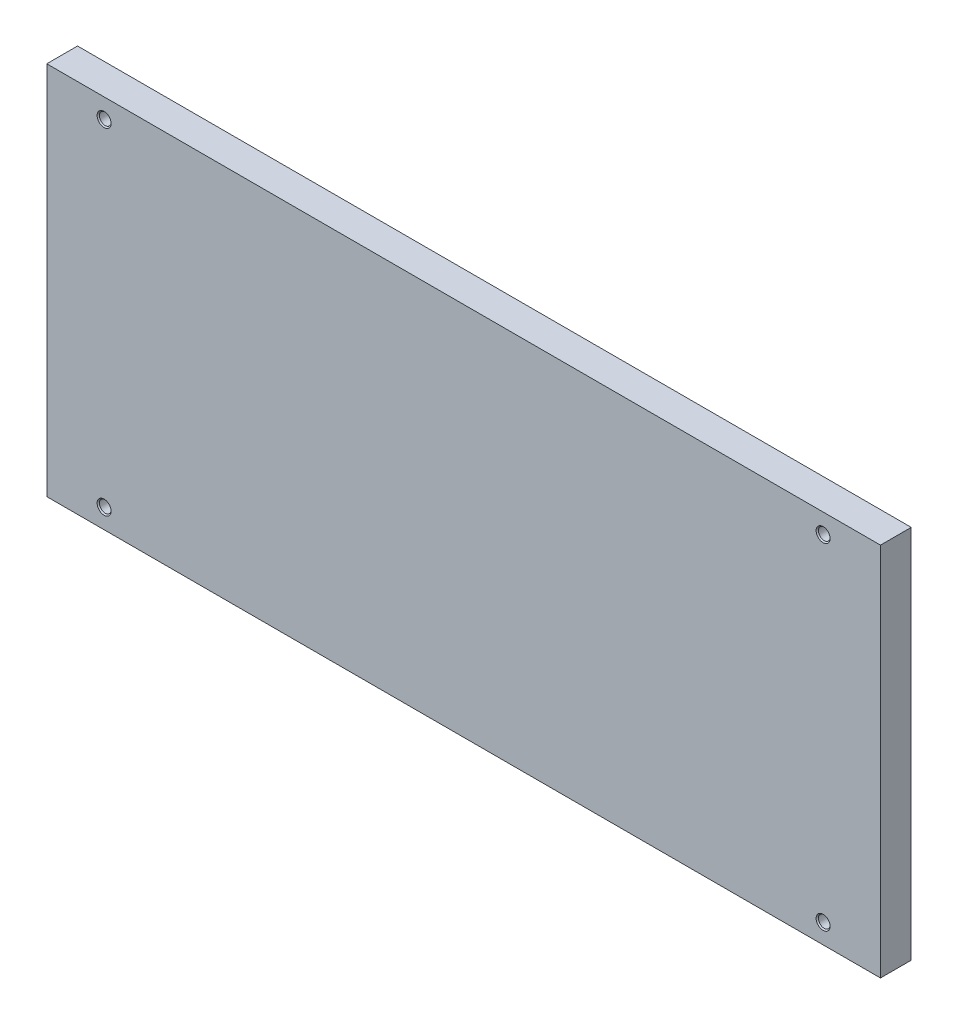
ISO-10303-21;
HEADER;
FILE_DESCRIPTION(('STEP AP214'),'2;1');
FILE_NAME('part.step','',(''),(''),'','','');
FILE_SCHEMA(('AUTOMOTIVE_DESIGN { 1 0 10303 214 1 1 1 1 }'));
ENDSEC;
DATA;
#1=APPLICATION_CONTEXT('core data for automotive mechanical design processes');
#2=APPLICATION_PROTOCOL_DEFINITION('international standard','automotive_design',2000,#1);
#3=PRODUCT_CONTEXT('',#1,'mechanical');
#4=PRODUCT('Part','Part','',(#3));
#5=PRODUCT_RELATED_PRODUCT_CATEGORY('part','',(#4));
#6=PRODUCT_DEFINITION_FORMATION('','',#4);
#7=PRODUCT_DEFINITION_CONTEXT('part definition',#1,'design');
#8=PRODUCT_DEFINITION('design','',#6,#7);
#9=PRODUCT_DEFINITION_SHAPE('','',#8);
#10=(LENGTH_UNIT() NAMED_UNIT(*) SI_UNIT(.MILLI.,.METRE.));
#11=(NAMED_UNIT(*) PLANE_ANGLE_UNIT() SI_UNIT($,.RADIAN.));
#12=(NAMED_UNIT(*) SI_UNIT($,.STERADIAN.) SOLID_ANGLE_UNIT());
#13=UNCERTAINTY_MEASURE_WITH_UNIT(LENGTH_MEASURE(1.E-05),#10,'distance_accuracy_value','');
#14=(GEOMETRIC_REPRESENTATION_CONTEXT(3) GLOBAL_UNCERTAINTY_ASSIGNED_CONTEXT((#13)) GLOBAL_UNIT_ASSIGNED_CONTEXT((#10,
#11,#12)) REPRESENTATION_CONTEXT('',''));
#15=CARTESIAN_POINT('',(0.,0.,0.));
#16=DIRECTION('',(0.,0.,1.));
#17=DIRECTION('',(1.,0.,0.));
#18=AXIS2_PLACEMENT_3D('',#15,#16,#17);
#19=CARTESIAN_POINT('',(0.,0.,22.));
#20=DIRECTION('',(0.,0.,1.));
#21=DIRECTION('',(1.,0.,0.));
#22=AXIS2_PLACEMENT_3D('',#19,#20,#21);
#23=PLANE('',#22);
#24=CARTESIAN_POINT('',(257.,120.,22.));
#25=DIRECTION('',(0.,0.,1.));
#26=DIRECTION('',(1.,0.,0.));
#27=AXIS2_PLACEMENT_3D('',#24,#25,#26);
#28=CIRCLE('',#27,5.);
#29=CARTESIAN_POINT('',(262.,120.,22.));
#30=VERTEX_POINT('',#29);
#31=EDGE_CURVE('E139',#30,#30,#28,.T.);
#32=ORIENTED_EDGE('',*,*,#31,.F.);
#33=EDGE_LOOP('',(#32));
#34=FACE_BOUND('',#33,.T.);
#35=CARTESIAN_POINT('',(-257.,120.,22.));
#36=DIRECTION('',(0.,0.,1.));
#37=DIRECTION('',(1.,0.,0.));
#38=AXIS2_PLACEMENT_3D('',#35,#36,#37);
#39=CIRCLE('',#38,5.);
#40=CARTESIAN_POINT('',(-252.,120.,22.));
#41=VERTEX_POINT('',#40);
#42=EDGE_CURVE('E104',#41,#41,#39,.T.);
#43=ORIENTED_EDGE('',*,*,#42,.F.);
#44=EDGE_LOOP('',(#43));
#45=FACE_BOUND('',#44,.T.);
#46=DIRECTION('',(0.,-1.,0.));
#47=VECTOR('',#46,1.);
#48=CARTESIAN_POINT('',(-298.,134.,22.));
#49=LINE('',#48,#47);
#50=CARTESIAN_POINT('',(-298.,134.,22.));
#51=VERTEX_POINT('',#50);
#52=CARTESIAN_POINT('',(-298.,-134.,22.));
#53=VERTEX_POINT('',#52);
#54=EDGE_CURVE('E89',#51,#53,#49,.T.);
#55=ORIENTED_EDGE('',*,*,#54,.T.);
#56=DIRECTION('',(1.,0.,0.));
#57=VECTOR('',#56,1.);
#58=CARTESIAN_POINT('',(-298.,-134.,22.));
#59=LINE('',#58,#57);
#60=CARTESIAN_POINT('',(298.,-134.,22.));
#61=VERTEX_POINT('',#60);
#62=EDGE_CURVE('E84',#53,#61,#59,.T.);
#63=ORIENTED_EDGE('',*,*,#62,.T.);
#64=DIRECTION('',(0.,1.,0.));
#65=VECTOR('',#64,1.);
#66=CARTESIAN_POINT('',(298.,-134.,22.));
#67=LINE('',#66,#65);
#68=CARTESIAN_POINT('',(298.,134.,22.));
#69=VERTEX_POINT('',#68);
#70=EDGE_CURVE('E87',#61,#69,#67,.T.);
#71=ORIENTED_EDGE('',*,*,#70,.T.);
#72=DIRECTION('',(-1.,0.,0.));
#73=VECTOR('',#72,1.);
#74=CARTESIAN_POINT('',(298.,134.,22.));
#75=LINE('',#74,#73);
#76=EDGE_CURVE('E54',#69,#51,#75,.T.);
#77=ORIENTED_EDGE('',*,*,#76,.T.);
#78=EDGE_LOOP('',(#55,#63,#71,#77));
#79=FACE_BOUND('',#78,.T.);
#80=CARTESIAN_POINT('',(-257.,-120.,22.));
#81=DIRECTION('',(0.,0.,-1.));
#82=DIRECTION('',(-1.,0.,0.));
#83=AXIS2_PLACEMENT_3D('',#80,#81,#82);
#84=CIRCLE('',#83,5.);
#85=CARTESIAN_POINT('',(-262.,-120.,22.));
#86=VERTEX_POINT('',#85);
#87=EDGE_CURVE('E136',#86,#86,#84,.T.);
#88=ORIENTED_EDGE('',*,*,#87,.T.);
#89=EDGE_LOOP('',(#88));
#90=FACE_BOUND('',#89,.T.);
#91=CARTESIAN_POINT('',(257.,-120.,22.));
#92=DIRECTION('',(0.,0.,-1.));
#93=DIRECTION('',(-1.,0.,0.));
#94=AXIS2_PLACEMENT_3D('',#91,#92,#93);
#95=CIRCLE('',#94,5.);
#96=CARTESIAN_POINT('',(252.,-120.,22.));
#97=VERTEX_POINT('',#96);
#98=EDGE_CURVE('E160',#97,#97,#95,.T.);
#99=ORIENTED_EDGE('',*,*,#98,.T.);
#100=EDGE_LOOP('',(#99));
#101=FACE_BOUND('',#100,.T.);
#102=ADVANCED_FACE('F37',(#34,#45,#79,#90,#101),#23,.T.);
#103=CARTESIAN_POINT('',(0.,0.,0.));
#104=DIRECTION('',(0.,0.,1.));
#105=DIRECTION('',(1.,0.,0.));
#106=AXIS2_PLACEMENT_3D('',#103,#104,#105);
#107=PLANE('',#106);
#108=CARTESIAN_POINT('',(257.,120.,0.));
#109=DIRECTION('',(0.,0.,1.));
#110=DIRECTION('',(1.,0.,0.));
#111=AXIS2_PLACEMENT_3D('',#108,#109,#110);
#112=CIRCLE('',#111,5.);
#113=CARTESIAN_POINT('',(262.,120.,0.));
#114=VERTEX_POINT('',#113);
#115=EDGE_CURVE('E148',#114,#114,#112,.T.);
#116=ORIENTED_EDGE('',*,*,#115,.T.);
#117=EDGE_LOOP('',(#116));
#118=FACE_BOUND('',#117,.T.);
#119=CARTESIAN_POINT('',(-257.,120.,0.));
#120=DIRECTION('',(0.,0.,1.));
#121=DIRECTION('',(1.,0.,0.));
#122=AXIS2_PLACEMENT_3D('',#119,#120,#121);
#123=CIRCLE('',#122,5.);
#124=CARTESIAN_POINT('',(-252.,120.,0.));
#125=VERTEX_POINT('',#124);
#126=EDGE_CURVE('E124',#125,#125,#123,.T.);
#127=ORIENTED_EDGE('',*,*,#126,.T.);
#128=EDGE_LOOP('',(#127));
#129=FACE_BOUND('',#128,.T.);
#130=DIRECTION('',(0.,-1.,0.));
#131=VECTOR('',#130,1.);
#132=CARTESIAN_POINT('',(-298.,134.,0.));
#133=LINE('',#132,#131);
#134=CARTESIAN_POINT('',(-298.,134.,0.));
#135=VERTEX_POINT('',#134);
#136=CARTESIAN_POINT('',(-298.,-134.,0.));
#137=VERTEX_POINT('',#136);
#138=EDGE_CURVE('E101',#135,#137,#133,.T.);
#139=ORIENTED_EDGE('',*,*,#138,.F.);
#140=DIRECTION('',(-1.,0.,0.));
#141=VECTOR('',#140,1.);
#142=CARTESIAN_POINT('',(298.,134.,0.));
#143=LINE('',#142,#141);
#144=CARTESIAN_POINT('',(298.,134.,0.));
#145=VERTEX_POINT('',#144);
#146=EDGE_CURVE('E77',#145,#135,#143,.T.);
#147=ORIENTED_EDGE('',*,*,#146,.F.);
#148=DIRECTION('',(0.,1.,0.));
#149=VECTOR('',#148,1.);
#150=CARTESIAN_POINT('',(298.,-134.,0.));
#151=LINE('',#150,#149);
#152=CARTESIAN_POINT('',(298.,-134.,0.));
#153=VERTEX_POINT('',#152);
#154=EDGE_CURVE('E71',#153,#145,#151,.T.);
#155=ORIENTED_EDGE('',*,*,#154,.F.);
#156=DIRECTION('',(1.,0.,0.));
#157=VECTOR('',#156,1.);
#158=CARTESIAN_POINT('',(-298.,-134.,0.));
#159=LINE('',#158,#157);
#160=EDGE_CURVE('E93',#137,#153,#159,.T.);
#161=ORIENTED_EDGE('',*,*,#160,.F.);
#162=EDGE_LOOP('',(#139,#147,#155,#161));
#163=FACE_BOUND('',#162,.T.);
#164=CARTESIAN_POINT('',(-257.,-120.,0.));
#165=DIRECTION('',(0.,0.,-1.));
#166=DIRECTION('',(-1.,0.,0.));
#167=AXIS2_PLACEMENT_3D('',#164,#165,#166);
#168=CIRCLE('',#167,5.);
#169=CARTESIAN_POINT('',(-262.,-120.,0.));
#170=VERTEX_POINT('',#169);
#171=EDGE_CURVE('E127',#170,#170,#168,.T.);
#172=ORIENTED_EDGE('',*,*,#171,.F.);
#173=EDGE_LOOP('',(#172));
#174=FACE_BOUND('',#173,.T.);
#175=CARTESIAN_POINT('',(257.,-120.,0.));
#176=DIRECTION('',(0.,0.,-1.));
#177=DIRECTION('',(-1.,0.,0.));
#178=AXIS2_PLACEMENT_3D('',#175,#176,#177);
#179=CIRCLE('',#178,5.);
#180=CARTESIAN_POINT('',(252.,-120.,0.));
#181=VERTEX_POINT('',#180);
#182=EDGE_CURVE('E151',#181,#181,#179,.T.);
#183=ORIENTED_EDGE('',*,*,#182,.F.);
#184=EDGE_LOOP('',(#183));
#185=FACE_BOUND('',#184,.T.);
#186=ADVANCED_FACE('F112',(#118,#129,#163,#174,#185),#107,.F.);
#187=CARTESIAN_POINT('',(-298.,134.,22.));
#188=DIRECTION('',(1.,0.,0.));
#189=DIRECTION('',(0.,0.,-1.));
#190=AXIS2_PLACEMENT_3D('',#187,#188,#189);
#191=PLANE('',#190);
#192=ORIENTED_EDGE('',*,*,#138,.T.);
#193=DIRECTION('',(0.,0.,-1.));
#194=VECTOR('',#193,1.);
#195=CARTESIAN_POINT('',(-298.,-134.,22.));
#196=LINE('',#195,#194);
#197=EDGE_CURVE('E11',#53,#137,#196,.T.);
#198=ORIENTED_EDGE('',*,*,#197,.F.);
#199=ORIENTED_EDGE('',*,*,#54,.F.);
#200=DIRECTION('',(0.,0.,-1.));
#201=VECTOR('',#200,1.);
#202=CARTESIAN_POINT('',(-298.,134.,22.));
#203=LINE('',#202,#201);
#204=EDGE_CURVE('E97',#51,#135,#203,.T.);
#205=ORIENTED_EDGE('',*,*,#204,.T.);
#206=EDGE_LOOP('',(#192,#198,#199,#205));
#207=FACE_BOUND('',#206,.T.);
#208=ADVANCED_FACE('F39',(#207),#191,.F.);
#209=CARTESIAN_POINT('',(-298.,-134.,22.));
#210=DIRECTION('',(0.,1.,0.));
#211=DIRECTION('',(0.,0.,1.));
#212=AXIS2_PLACEMENT_3D('',#209,#210,#211);
#213=PLANE('',#212);
#214=ORIENTED_EDGE('',*,*,#160,.T.);
#215=DIRECTION('',(0.,0.,-1.));
#216=VECTOR('',#215,1.);
#217=CARTESIAN_POINT('',(298.,-134.,22.));
#218=LINE('',#217,#216);
#219=EDGE_CURVE('E46',#61,#153,#218,.T.);
#220=ORIENTED_EDGE('',*,*,#219,.F.);
#221=ORIENTED_EDGE('',*,*,#62,.F.);
#222=ORIENTED_EDGE('',*,*,#197,.T.);
#223=EDGE_LOOP('',(#214,#220,#221,#222));
#224=FACE_BOUND('',#223,.T.);
#225=ADVANCED_FACE('F92',(#224),#213,.F.);
#226=CARTESIAN_POINT('',(298.,-134.,22.));
#227=DIRECTION('',(-1.,0.,0.));
#228=DIRECTION('',(0.,0.,1.));
#229=AXIS2_PLACEMENT_3D('',#226,#227,#228);
#230=PLANE('',#229);
#231=ORIENTED_EDGE('',*,*,#154,.T.);
#232=DIRECTION('',(0.,0.,-1.));
#233=VECTOR('',#232,1.);
#234=CARTESIAN_POINT('',(298.,134.,22.));
#235=LINE('',#234,#233);
#236=EDGE_CURVE('E94',#69,#145,#235,.T.);
#237=ORIENTED_EDGE('',*,*,#236,.F.);
#238=ORIENTED_EDGE('',*,*,#70,.F.);
#239=ORIENTED_EDGE('',*,*,#219,.T.);
#240=EDGE_LOOP('',(#231,#237,#238,#239));
#241=FACE_BOUND('',#240,.T.);
#242=ADVANCED_FACE('F95',(#241),#230,.F.);
#243=CARTESIAN_POINT('',(298.,134.,22.));
#244=DIRECTION('',(0.,-1.,0.));
#245=DIRECTION('',(0.,0.,-1.));
#246=AXIS2_PLACEMENT_3D('',#243,#244,#245);
#247=PLANE('',#246);
#248=ORIENTED_EDGE('',*,*,#146,.T.);
#249=ORIENTED_EDGE('',*,*,#204,.F.);
#250=ORIENTED_EDGE('',*,*,#76,.F.);
#251=ORIENTED_EDGE('',*,*,#236,.T.);
#252=EDGE_LOOP('',(#248,#249,#250,#251));
#253=FACE_BOUND('',#252,.T.);
#254=ADVANCED_FACE('F109',(#253),#247,.F.);
#255=CARTESIAN_POINT('',(-257.,120.,21.188));
#256=DIRECTION('',(0.,0.,1.));
#257=DIRECTION('',(1.,0.,0.));
#258=AXIS2_PLACEMENT_3D('',#255,#256,#257);
#259=CONICAL_SURFACE('',#258,4.18800000000001,0.785398163397446);
#260=ORIENTED_EDGE('',*,*,#42,.T.);
#261=EDGE_LOOP('',(#260));
#262=FACE_BOUND('',#261,.T.);
#263=CARTESIAN_POINT('',(-257.,120.,21.188));
#264=DIRECTION('',(0.,0.,1.));
#265=DIRECTION('',(1.,0.,0.));
#266=AXIS2_PLACEMENT_3D('',#263,#264,#265);
#267=CIRCLE('',#266,4.18800000000001);
#268=CARTESIAN_POINT('',(-252.812,120.,21.188));
#269=VERTEX_POINT('',#268);
#270=EDGE_CURVE('E118',#269,#269,#267,.T.);
#271=ORIENTED_EDGE('',*,*,#270,.F.);
#272=EDGE_LOOP('',(#271));
#273=FACE_BOUND('',#272,.T.);
#274=ADVANCED_FACE('F187',(#262,#273),#259,.F.);
#275=CARTESIAN_POINT('',(-257.,120.,0.));
#276=DIRECTION('',(0.,0.,1.));
#277=DIRECTION('',(1.,0.,0.));
#278=AXIS2_PLACEMENT_3D('',#275,#276,#277);
#279=CYLINDRICAL_SURFACE('',#278,4.18800000000001);
#280=ORIENTED_EDGE('',*,*,#270,.T.);
#281=EDGE_LOOP('',(#280));
#282=FACE_BOUND('',#281,.T.);
#283=CARTESIAN_POINT('',(-257.,120.,0.811999999999998));
#284=DIRECTION('',(0.,0.,1.));
#285=DIRECTION('',(1.,0.,0.));
#286=AXIS2_PLACEMENT_3D('',#283,#284,#285);
#287=CIRCLE('',#286,4.18800000000001);
#288=CARTESIAN_POINT('',(-252.812,120.,0.811999999999998));
#289=VERTEX_POINT('',#288);
#290=EDGE_CURVE('E121',#289,#289,#287,.T.);
#291=ORIENTED_EDGE('',*,*,#290,.F.);
#292=EDGE_LOOP('',(#291));
#293=FACE_BOUND('',#292,.T.);
#294=ADVANCED_FACE('F305',(#282,#293),#279,.F.);
#295=CARTESIAN_POINT('',(-257.,120.,0.));
#296=DIRECTION('',(0.,0.,-1.));
#297=DIRECTION('',(-1.,0.,0.));
#298=AXIS2_PLACEMENT_3D('',#295,#296,#297);
#299=CONICAL_SURFACE('',#298,5.,0.785398163397446);
#300=ORIENTED_EDGE('',*,*,#290,.T.);
#301=EDGE_LOOP('',(#300));
#302=FACE_BOUND('',#301,.T.);
#303=ORIENTED_EDGE('',*,*,#126,.F.);
#304=EDGE_LOOP('',(#303));
#305=FACE_BOUND('',#304,.T.);
#306=ADVANCED_FACE('F295',(#302,#305),#299,.F.);
#307=CARTESIAN_POINT('',(-257.,-120.,0.811999999999997));
#308=DIRECTION('',(0.,0.,-1.));
#309=DIRECTION('',(-1.,0.,0.));
#310=AXIS2_PLACEMENT_3D('',#307,#308,#309);
#311=CONICAL_SURFACE('',#310,4.18800000000001,0.785398163397446);
#312=ORIENTED_EDGE('',*,*,#171,.T.);
#313=EDGE_LOOP('',(#312));
#314=FACE_BOUND('',#313,.T.);
#315=CARTESIAN_POINT('',(-257.,-120.,0.811999999999997));
#316=DIRECTION('',(0.,0.,-1.));
#317=DIRECTION('',(-1.,0.,0.));
#318=AXIS2_PLACEMENT_3D('',#315,#316,#317);
#319=CIRCLE('',#318,4.18800000000001);
#320=CARTESIAN_POINT('',(-261.188,-120.,0.811999999999997));
#321=VERTEX_POINT('',#320);
#322=EDGE_CURVE('E130',#321,#321,#319,.T.);
#323=ORIENTED_EDGE('',*,*,#322,.F.);
#324=EDGE_LOOP('',(#323));
#325=FACE_BOUND('',#324,.T.);
#326=ADVANCED_FACE('F285',(#314,#325),#311,.F.);
#327=CARTESIAN_POINT('',(-257.,-120.,22.));
#328=DIRECTION('',(0.,0.,-1.));
#329=DIRECTION('',(-1.,0.,0.));
#330=AXIS2_PLACEMENT_3D('',#327,#328,#329);
#331=CYLINDRICAL_SURFACE('',#330,4.18800000000001);
#332=ORIENTED_EDGE('',*,*,#322,.T.);
#333=EDGE_LOOP('',(#332));
#334=FACE_BOUND('',#333,.T.);
#335=CARTESIAN_POINT('',(-257.,-120.,21.188));
#336=DIRECTION('',(0.,0.,-1.));
#337=DIRECTION('',(-1.,0.,0.));
#338=AXIS2_PLACEMENT_3D('',#335,#336,#337);
#339=CIRCLE('',#338,4.18800000000001);
#340=CARTESIAN_POINT('',(-261.188,-120.,21.188));
#341=VERTEX_POINT('',#340);
#342=EDGE_CURVE('E133',#341,#341,#339,.T.);
#343=ORIENTED_EDGE('',*,*,#342,.F.);
#344=EDGE_LOOP('',(#343));
#345=FACE_BOUND('',#344,.T.);
#346=ADVANCED_FACE('F275',(#334,#345),#331,.F.);
#347=CARTESIAN_POINT('',(-257.,-120.,22.));
#348=DIRECTION('',(0.,0.,1.));
#349=DIRECTION('',(1.,0.,0.));
#350=AXIS2_PLACEMENT_3D('',#347,#348,#349);
#351=CONICAL_SURFACE('',#350,5.,0.785398163397442);
#352=ORIENTED_EDGE('',*,*,#342,.T.);
#353=EDGE_LOOP('',(#352));
#354=FACE_BOUND('',#353,.T.);
#355=ORIENTED_EDGE('',*,*,#87,.F.);
#356=EDGE_LOOP('',(#355));
#357=FACE_BOUND('',#356,.T.);
#358=ADVANCED_FACE('F265',(#354,#357),#351,.F.);
#359=CARTESIAN_POINT('',(257.,120.,21.188));
#360=DIRECTION('',(0.,0.,1.));
#361=DIRECTION('',(1.,0.,0.));
#362=AXIS2_PLACEMENT_3D('',#359,#360,#361);
#363=CONICAL_SURFACE('',#362,4.18800000000001,0.785398163397446);
#364=ORIENTED_EDGE('',*,*,#31,.T.);
#365=EDGE_LOOP('',(#364));
#366=FACE_BOUND('',#365,.T.);
#367=CARTESIAN_POINT('',(257.,120.,21.188));
#368=DIRECTION('',(0.,0.,1.));
#369=DIRECTION('',(1.,0.,0.));
#370=AXIS2_PLACEMENT_3D('',#367,#368,#369);
#371=CIRCLE('',#370,4.18800000000001);
#372=CARTESIAN_POINT('',(261.188,120.,21.188));
#373=VERTEX_POINT('',#372);
#374=EDGE_CURVE('E142',#373,#373,#371,.T.);
#375=ORIENTED_EDGE('',*,*,#374,.F.);
#376=EDGE_LOOP('',(#375));
#377=FACE_BOUND('',#376,.T.);
#378=ADVANCED_FACE('F256',(#366,#377),#363,.F.);
#379=CARTESIAN_POINT('',(257.,120.,0.));
#380=DIRECTION('',(0.,0.,1.));
#381=DIRECTION('',(1.,0.,0.));
#382=AXIS2_PLACEMENT_3D('',#379,#380,#381);
#383=CYLINDRICAL_SURFACE('',#382,4.18800000000001);
#384=ORIENTED_EDGE('',*,*,#374,.T.);
#385=EDGE_LOOP('',(#384));
#386=FACE_BOUND('',#385,.T.);
#387=CARTESIAN_POINT('',(257.,120.,0.811999999999998));
#388=DIRECTION('',(0.,0.,1.));
#389=DIRECTION('',(1.,0.,0.));
#390=AXIS2_PLACEMENT_3D('',#387,#388,#389);
#391=CIRCLE('',#390,4.18800000000001);
#392=CARTESIAN_POINT('',(261.188,120.,0.811999999999998));
#393=VERTEX_POINT('',#392);
#394=EDGE_CURVE('E145',#393,#393,#391,.T.);
#395=ORIENTED_EDGE('',*,*,#394,.F.);
#396=EDGE_LOOP('',(#395));
#397=FACE_BOUND('',#396,.T.);
#398=ADVANCED_FACE('F246',(#386,#397),#383,.F.);
#399=CARTESIAN_POINT('',(257.,120.,0.));
#400=DIRECTION('',(0.,0.,-1.));
#401=DIRECTION('',(-1.,0.,0.));
#402=AXIS2_PLACEMENT_3D('',#399,#400,#401);
#403=CONICAL_SURFACE('',#402,5.,0.785398163397446);
#404=ORIENTED_EDGE('',*,*,#394,.T.);
#405=EDGE_LOOP('',(#404));
#406=FACE_BOUND('',#405,.T.);
#407=ORIENTED_EDGE('',*,*,#115,.F.);
#408=EDGE_LOOP('',(#407));
#409=FACE_BOUND('',#408,.T.);
#410=ADVANCED_FACE('F229',(#406,#409),#403,.F.);
#411=CARTESIAN_POINT('',(257.,-120.,0.811999999999997));
#412=DIRECTION('',(0.,0.,-1.));
#413=DIRECTION('',(-1.,0.,0.));
#414=AXIS2_PLACEMENT_3D('',#411,#412,#413);
#415=CONICAL_SURFACE('',#414,4.18800000000001,0.785398163397446);
#416=ORIENTED_EDGE('',*,*,#182,.T.);
#417=EDGE_LOOP('',(#416));
#418=FACE_BOUND('',#417,.T.);
#419=CARTESIAN_POINT('',(257.,-120.,0.811999999999997));
#420=DIRECTION('',(0.,0.,-1.));
#421=DIRECTION('',(-1.,0.,0.));
#422=AXIS2_PLACEMENT_3D('',#419,#420,#421);
#423=CIRCLE('',#422,4.18800000000001);
#424=CARTESIAN_POINT('',(252.812,-120.,0.811999999999997));
#425=VERTEX_POINT('',#424);
#426=EDGE_CURVE('E154',#425,#425,#423,.T.);
#427=ORIENTED_EDGE('',*,*,#426,.F.);
#428=EDGE_LOOP('',(#427));
#429=FACE_BOUND('',#428,.T.);
#430=ADVANCED_FACE('F173',(#418,#429),#415,.F.);
#431=CARTESIAN_POINT('',(257.,-120.,22.));
#432=DIRECTION('',(0.,0.,-1.));
#433=DIRECTION('',(-1.,0.,0.));
#434=AXIS2_PLACEMENT_3D('',#431,#432,#433);
#435=CYLINDRICAL_SURFACE('',#434,4.18800000000001);
#436=ORIENTED_EDGE('',*,*,#426,.T.);
#437=EDGE_LOOP('',(#436));
#438=FACE_BOUND('',#437,.T.);
#439=CARTESIAN_POINT('',(257.,-120.,21.188));
#440=DIRECTION('',(0.,0.,-1.));
#441=DIRECTION('',(-1.,0.,0.));
#442=AXIS2_PLACEMENT_3D('',#439,#440,#441);
#443=CIRCLE('',#442,4.18800000000001);
#444=CARTESIAN_POINT('',(252.812,-120.,21.188));
#445=VERTEX_POINT('',#444);
#446=EDGE_CURVE('E157',#445,#445,#443,.T.);
#447=ORIENTED_EDGE('',*,*,#446,.F.);
#448=EDGE_LOOP('',(#447));
#449=FACE_BOUND('',#448,.T.);
#450=ADVANCED_FACE('F167',(#438,#449),#435,.F.);
#451=CARTESIAN_POINT('',(257.,-120.,22.));
#452=DIRECTION('',(0.,0.,1.));
#453=DIRECTION('',(1.,0.,0.));
#454=AXIS2_PLACEMENT_3D('',#451,#452,#453);
#455=CONICAL_SURFACE('',#454,5.,0.785398163397442);
#456=ORIENTED_EDGE('',*,*,#446,.T.);
#457=EDGE_LOOP('',(#456));
#458=FACE_BOUND('',#457,.T.);
#459=ORIENTED_EDGE('',*,*,#98,.F.);
#460=EDGE_LOOP('',(#459));
#461=FACE_BOUND('',#460,.T.);
#462=ADVANCED_FACE('F165',(#458,#461),#455,.F.);
#463=CLOSED_SHELL('',(#102,#186,#208,#225,#242,#254,#274,#294,#306,#326,#346,#358,#378,#398,
#410,#430,#450,#462));
#464=MANIFOLD_SOLID_BREP('B2',#463);
#465=ADVANCED_BREP_SHAPE_REPRESENTATION('',(#18,#464),#14);
#466=SHAPE_DEFINITION_REPRESENTATION(#9,#465);
ENDSEC;
END-ISO-10303-21;
